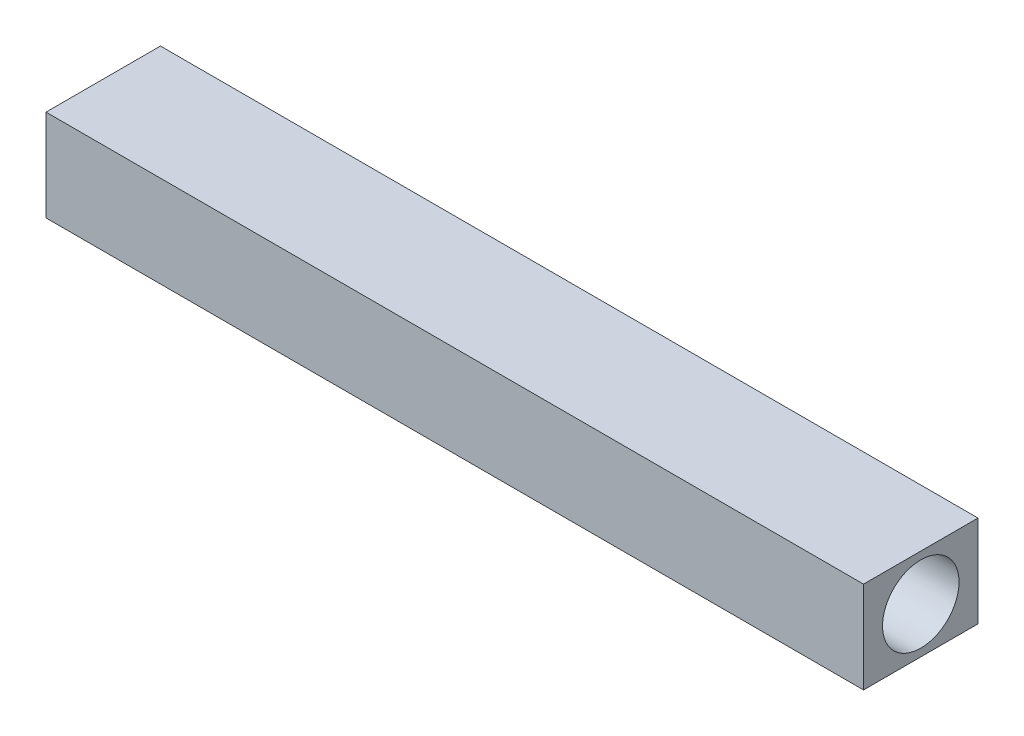
ISO-10303-21;
HEADER;
FILE_DESCRIPTION(('STEP AP214'),'2;1');
FILE_NAME('part.step','',(''),(''),'','','');
FILE_SCHEMA(('AUTOMOTIVE_DESIGN { 1 0 10303 214 1 1 1 1 }'));
ENDSEC;
DATA;
#1=APPLICATION_CONTEXT('core data for automotive mechanical design processes');
#2=APPLICATION_PROTOCOL_DEFINITION('international standard','automotive_design',2000,#1);
#3=PRODUCT_CONTEXT('',#1,'mechanical');
#4=PRODUCT('Part','Part','',(#3));
#5=PRODUCT_RELATED_PRODUCT_CATEGORY('part','',(#4));
#6=PRODUCT_DEFINITION_FORMATION('','',#4);
#7=PRODUCT_DEFINITION_CONTEXT('part definition',#1,'design');
#8=PRODUCT_DEFINITION('design','',#6,#7);
#9=PRODUCT_DEFINITION_SHAPE('','',#8);
#10=(LENGTH_UNIT() NAMED_UNIT(*) SI_UNIT(.MILLI.,.METRE.));
#11=(NAMED_UNIT(*) PLANE_ANGLE_UNIT() SI_UNIT($,.RADIAN.));
#12=(NAMED_UNIT(*) SI_UNIT($,.STERADIAN.) SOLID_ANGLE_UNIT());
#13=UNCERTAINTY_MEASURE_WITH_UNIT(LENGTH_MEASURE(1.E-05),#10,'distance_accuracy_value','');
#14=(GEOMETRIC_REPRESENTATION_CONTEXT(3) GLOBAL_UNCERTAINTY_ASSIGNED_CONTEXT((#13)) GLOBAL_UNIT_ASSIGNED_CONTEXT((#10,
#11,#12)) REPRESENTATION_CONTEXT('',''));
#15=CARTESIAN_POINT('',(0.,0.,0.));
#16=DIRECTION('',(0.,0.,1.));
#17=DIRECTION('',(1.,0.,0.));
#18=AXIS2_PLACEMENT_3D('',#15,#16,#17);
#19=CARTESIAN_POINT('',(-31.75,10.16,44.45));
#20=DIRECTION('',(1.,0.,0.));
#21=DIRECTION('',(0.,0.,-1.));
#22=AXIS2_PLACEMENT_3D('',#19,#20,#21);
#23=PLANE('',#22);
#24=CARTESIAN_POINT('',(-31.75,6.6,48.895));
#25=DIRECTION('',(1.,0.,0.));
#26=DIRECTION('',(0.,0.,-1.));
#27=AXIS2_PLACEMENT_3D('',#24,#25,#26);
#28=CIRCLE('',#27,2.9718);
#29=CARTESIAN_POINT('',(-31.75,6.6,51.8668));
#30=VERTEX_POINT('',#29);
#31=EDGE_CURVE('E224',#30,#30,#28,.T.);
#32=ORIENTED_EDGE('',*,*,#31,.T.);
#33=EDGE_LOOP('',(#32));
#34=FACE_BOUND('',#33,.T.);
#35=DIRECTION('',(0.,1.,0.));
#36=VECTOR('',#35,1.);
#37=CARTESIAN_POINT('',(-31.75,-64.1192802517308,44.45));
#38=LINE('',#37,#36);
#39=CARTESIAN_POINT('',(-31.75,3.04,44.45));
#40=VERTEX_POINT('',#39);
#41=CARTESIAN_POINT('',(-31.75,10.16,44.45));
#42=VERTEX_POINT('',#41);
#43=EDGE_CURVE('E89',#40,#42,#38,.T.);
#44=ORIENTED_EDGE('',*,*,#43,.F.);
#45=DIRECTION('',(0.,0.,-1.));
#46=VECTOR('',#45,1.);
#47=CARTESIAN_POINT('',(-31.75,3.04,116.841968473426));
#48=LINE('',#47,#46);
#49=CARTESIAN_POINT('',(-31.75,3.04,53.34));
#50=VERTEX_POINT('',#49);
#51=EDGE_CURVE('E45',#50,#40,#48,.T.);
#52=ORIENTED_EDGE('',*,*,#51,.F.);
#53=DIRECTION('',(0.,1.,0.));
#54=VECTOR('',#53,1.);
#55=CARTESIAN_POINT('',(-31.75,-64.1192802517308,53.34));
#56=LINE('',#55,#54);
#57=CARTESIAN_POINT('',(-31.75,10.16,53.34));
#58=VERTEX_POINT('',#57);
#59=EDGE_CURVE('E97',#50,#58,#56,.T.);
#60=ORIENTED_EDGE('',*,*,#59,.T.);
#61=DIRECTION('',(0.,0.,1.));
#62=VECTOR('',#61,1.);
#63=CARTESIAN_POINT('',(-31.75,10.16,44.45));
#64=LINE('',#63,#62);
#65=EDGE_CURVE('E81',#42,#58,#64,.T.);
#66=ORIENTED_EDGE('',*,*,#65,.F.);
#67=EDGE_LOOP('',(#44,#52,#60,#66));
#68=FACE_BOUND('',#67,.T.);
#69=ADVANCED_FACE('F35',(#34,#68),#23,.F.);
#70=CARTESIAN_POINT('',(31.75,2.54,49.53));
#71=DIRECTION('',(-1.,0.,0.));
#72=DIRECTION('',(0.,0.,1.));
#73=AXIS2_PLACEMENT_3D('',#70,#71,#72);
#74=PLANE('',#73);
#75=CARTESIAN_POINT('',(31.75,6.6,48.895));
#76=DIRECTION('',(1.,0.,0.));
#77=DIRECTION('',(0.,0.,-1.));
#78=AXIS2_PLACEMENT_3D('',#75,#76,#77);
#79=CIRCLE('',#78,2.9718);
#80=CARTESIAN_POINT('',(31.75,6.6,45.9232));
#81=VERTEX_POINT('',#80);
#82=EDGE_CURVE('E100',#81,#81,#79,.T.);
#83=ORIENTED_EDGE('',*,*,#82,.F.);
#84=EDGE_LOOP('',(#83));
#85=FACE_BOUND('',#84,.T.);
#86=DIRECTION('',(0.,0.,-1.));
#87=VECTOR('',#86,1.);
#88=CARTESIAN_POINT('',(31.75,10.16,44.45));
#89=LINE('',#88,#87);
#90=CARTESIAN_POINT('',(31.75,10.16,53.34));
#91=VERTEX_POINT('',#90);
#92=CARTESIAN_POINT('',(31.75,10.16,44.45));
#93=VERTEX_POINT('',#92);
#94=EDGE_CURVE('E103',#91,#93,#89,.T.);
#95=ORIENTED_EDGE('',*,*,#94,.F.);
#96=DIRECTION('',(0.,1.,0.));
#97=VECTOR('',#96,1.);
#98=CARTESIAN_POINT('',(31.75,-64.1192802517308,53.34));
#99=LINE('',#98,#97);
#100=CARTESIAN_POINT('',(31.75,3.04,53.34));
#101=VERTEX_POINT('',#100);
#102=EDGE_CURVE('E39',#101,#91,#99,.T.);
#103=ORIENTED_EDGE('',*,*,#102,.F.);
#104=DIRECTION('',(0.,0.,-1.));
#105=VECTOR('',#104,1.);
#106=CARTESIAN_POINT('',(31.75,3.04,116.841968473426));
#107=LINE('',#106,#105);
#108=CARTESIAN_POINT('',(31.75,3.04,44.45));
#109=VERTEX_POINT('',#108);
#110=EDGE_CURVE('E73',#101,#109,#107,.T.);
#111=ORIENTED_EDGE('',*,*,#110,.T.);
#112=DIRECTION('',(0.,1.,0.));
#113=VECTOR('',#112,1.);
#114=CARTESIAN_POINT('',(31.75,-64.1192802517308,44.45));
#115=LINE('',#114,#113);
#116=EDGE_CURVE('E75',#109,#93,#115,.T.);
#117=ORIENTED_EDGE('',*,*,#116,.T.);
#118=EDGE_LOOP('',(#95,#103,#111,#117));
#119=FACE_BOUND('',#118,.T.);
#120=ADVANCED_FACE('F37',(#85,#119),#74,.F.);
#121=CARTESIAN_POINT('',(-31.75,-64.1192802517308,53.34));
#122=DIRECTION('',(0.,0.,1.));
#123=DIRECTION('',(1.,0.,0.));
#124=AXIS2_PLACEMENT_3D('',#121,#122,#123);
#125=PLANE('',#124);
#126=DIRECTION('',(1.,0.,0.));
#127=VECTOR('',#126,1.);
#128=CARTESIAN_POINT('',(31.75,3.04,53.34));
#129=LINE('',#128,#127);
#130=EDGE_CURVE('E80',#50,#101,#129,.T.);
#131=ORIENTED_EDGE('',*,*,#130,.T.);
#132=ORIENTED_EDGE('',*,*,#102,.T.);
#133=DIRECTION('',(1.,0.,0.));
#134=VECTOR('',#133,1.);
#135=CARTESIAN_POINT('',(-31.75,10.16,53.34));
#136=LINE('',#135,#134);
#137=EDGE_CURVE('E104',#58,#91,#136,.T.);
#138=ORIENTED_EDGE('',*,*,#137,.F.);
#139=ORIENTED_EDGE('',*,*,#59,.F.);
#140=EDGE_LOOP('',(#131,#132,#138,#139));
#141=FACE_BOUND('',#140,.T.);
#142=ADVANCED_FACE('F113',(#141),#125,.T.);
#143=CARTESIAN_POINT('',(-31.75,-64.1192802517308,44.45));
#144=DIRECTION('',(0.,0.,-1.));
#145=DIRECTION('',(-1.,0.,0.));
#146=AXIS2_PLACEMENT_3D('',#143,#144,#145);
#147=PLANE('',#146);
#148=DIRECTION('',(1.,0.,0.));
#149=VECTOR('',#148,1.);
#150=CARTESIAN_POINT('',(31.75,3.04,44.45));
#151=LINE('',#150,#149);
#152=EDGE_CURVE('E11',#40,#109,#151,.T.);
#153=ORIENTED_EDGE('',*,*,#152,.F.);
#154=ORIENTED_EDGE('',*,*,#43,.T.);
#155=DIRECTION('',(-1.,0.,0.));
#156=VECTOR('',#155,1.);
#157=CARTESIAN_POINT('',(-31.75,10.16,44.45));
#158=LINE('',#157,#156);
#159=EDGE_CURVE('E88',#93,#42,#158,.T.);
#160=ORIENTED_EDGE('',*,*,#159,.F.);
#161=ORIENTED_EDGE('',*,*,#116,.F.);
#162=EDGE_LOOP('',(#153,#154,#160,#161));
#163=FACE_BOUND('',#162,.T.);
#164=ADVANCED_FACE('F85',(#163),#147,.T.);
#165=CARTESIAN_POINT('',(31.75,3.04,116.841968473426));
#166=DIRECTION('',(0.,1.,0.));
#167=DIRECTION('',(0.,0.,1.));
#168=AXIS2_PLACEMENT_3D('',#165,#166,#167);
#169=PLANE('',#168);
#170=ORIENTED_EDGE('',*,*,#130,.F.);
#171=ORIENTED_EDGE('',*,*,#51,.T.);
#172=ORIENTED_EDGE('',*,*,#152,.T.);
#173=ORIENTED_EDGE('',*,*,#110,.F.);
#174=EDGE_LOOP('',(#170,#171,#172,#173));
#175=FACE_BOUND('',#174,.T.);
#176=ADVANCED_FACE('F92',(#175),#169,.F.);
#177=CARTESIAN_POINT('',(0.,10.16,0.));
#178=DIRECTION('',(0.,1.,0.));
#179=DIRECTION('',(0.,0.,1.));
#180=AXIS2_PLACEMENT_3D('',#177,#178,#179);
#181=PLANE('',#180);
#182=ORIENTED_EDGE('',*,*,#159,.T.);
#183=ORIENTED_EDGE('',*,*,#65,.T.);
#184=ORIENTED_EDGE('',*,*,#137,.T.);
#185=ORIENTED_EDGE('',*,*,#94,.T.);
#186=EDGE_LOOP('',(#182,#183,#184,#185));
#187=FACE_BOUND('',#186,.T.);
#188=ADVANCED_FACE('F112',(#187),#181,.T.);
#189=CARTESIAN_POINT('',(26.35,6.6,48.895));
#190=DIRECTION('',(1.,0.,0.));
#191=DIRECTION('',(0.,0.,-1.));
#192=AXIS2_PLACEMENT_3D('',#189,#190,#191);
#193=CYLINDRICAL_SURFACE('',#192,2.9718);
#194=CARTESIAN_POINT('',(26.35,6.6,48.895));
#195=DIRECTION('',(1.,0.,0.));
#196=DIRECTION('',(0.,0.,-1.));
#197=AXIS2_PLACEMENT_3D('',#194,#195,#196);
#198=CIRCLE('',#197,2.9718);
#199=CARTESIAN_POINT('',(26.35,6.6,45.9232));
#200=VERTEX_POINT('',#199);
#201=EDGE_CURVE('E90',#200,#200,#198,.T.);
#202=CARTESIAN_POINT('',(26.35,6.6,45.9232));
#203=CARTESIAN_POINT('',(26.40625,6.6,45.9232));
#204=CARTESIAN_POINT('',(26.4625,6.6,45.9232));
#205=CARTESIAN_POINT('',(26.575,6.6,45.9232));
#206=CARTESIAN_POINT('',(26.63125,6.6,45.9232));
#207=CARTESIAN_POINT('',(26.74375,6.6,45.9232));
#208=CARTESIAN_POINT('',(26.8,6.6,45.9232));
#209=CARTESIAN_POINT('',(26.9125,6.6,45.9232));
#210=CARTESIAN_POINT('',(26.96875,6.6,45.9232));
#211=CARTESIAN_POINT('',(27.08125,6.6,45.9232));
#212=CARTESIAN_POINT('',(27.1375,6.6,45.9232));
#213=CARTESIAN_POINT('',(27.25,6.6,45.9232));
#214=CARTESIAN_POINT('',(27.30625,6.6,45.9232));
#215=CARTESIAN_POINT('',(27.41875,6.6,45.9232));
#216=CARTESIAN_POINT('',(27.475,6.6,45.9232));
#217=CARTESIAN_POINT('',(27.5875,6.6,45.9232));
#218=CARTESIAN_POINT('',(27.64375,6.6,45.9232));
#219=CARTESIAN_POINT('',(27.75625,6.6,45.9232));
#220=CARTESIAN_POINT('',(27.8125,6.6,45.9232));
#221=CARTESIAN_POINT('',(27.925,6.6,45.9232));
#222=CARTESIAN_POINT('',(27.98125,6.6,45.9232));
#223=CARTESIAN_POINT('',(28.09375,6.6,45.9232));
#224=CARTESIAN_POINT('',(28.15,6.6,45.9232));
#225=CARTESIAN_POINT('',(28.2625,6.6,45.9232));
#226=CARTESIAN_POINT('',(28.31875,6.6,45.9232));
#227=CARTESIAN_POINT('',(28.43125,6.6,45.9232));
#228=CARTESIAN_POINT('',(28.4875,6.6,45.9232));
#229=CARTESIAN_POINT('',(28.6,6.6,45.9232));
#230=CARTESIAN_POINT('',(28.65625,6.6,45.9232));
#231=CARTESIAN_POINT('',(28.76875,6.6,45.9232));
#232=CARTESIAN_POINT('',(28.825,6.6,45.9232));
#233=CARTESIAN_POINT('',(28.9375,6.6,45.9232));
#234=CARTESIAN_POINT('',(28.99375,6.6,45.9232));
#235=CARTESIAN_POINT('',(29.10625,6.6,45.9232));
#236=CARTESIAN_POINT('',(29.1625,6.6,45.9232));
#237=CARTESIAN_POINT('',(29.275,6.6,45.9232));
#238=CARTESIAN_POINT('',(29.33125,6.6,45.9232));
#239=CARTESIAN_POINT('',(29.44375,6.6,45.9232));
#240=CARTESIAN_POINT('',(29.5,6.6,45.9232));
#241=CARTESIAN_POINT('',(29.6125,6.6,45.9232));
#242=CARTESIAN_POINT('',(29.66875,6.6,45.9232));
#243=CARTESIAN_POINT('',(29.78125,6.6,45.9232));
#244=CARTESIAN_POINT('',(29.8375,6.6,45.9232));
#245=CARTESIAN_POINT('',(29.95,6.6,45.9232));
#246=CARTESIAN_POINT('',(30.00625,6.6,45.9232));
#247=CARTESIAN_POINT('',(30.11875,6.6,45.9232));
#248=CARTESIAN_POINT('',(30.175,6.6,45.9232));
#249=CARTESIAN_POINT('',(30.2875,6.6,45.9232));
#250=CARTESIAN_POINT('',(30.34375,6.6,45.9232));
#251=CARTESIAN_POINT('',(30.45625,6.6,45.9232));
#252=CARTESIAN_POINT('',(30.5125,6.6,45.9232));
#253=CARTESIAN_POINT('',(30.625,6.6,45.9232));
#254=CARTESIAN_POINT('',(30.68125,6.6,45.9232));
#255=CARTESIAN_POINT('',(30.79375,6.6,45.9232));
#256=CARTESIAN_POINT('',(30.85,6.6,45.9232));
#257=CARTESIAN_POINT('',(30.9625,6.6,45.9232));
#258=CARTESIAN_POINT('',(31.01875,6.6,45.9232));
#259=CARTESIAN_POINT('',(31.13125,6.6,45.9232));
#260=CARTESIAN_POINT('',(31.1875,6.6,45.9232));
#261=CARTESIAN_POINT('',(31.3,6.6,45.9232));
#262=CARTESIAN_POINT('',(31.35625,6.6,45.9232));
#263=CARTESIAN_POINT('',(31.46875,6.6,45.9232));
#264=CARTESIAN_POINT('',(31.525,6.6,45.9232));
#265=CARTESIAN_POINT('',(31.6375,6.6,45.9232));
#266=CARTESIAN_POINT('',(31.69375,6.6,45.9232));
#267=CARTESIAN_POINT('',(31.75,6.6,45.9232));
#268=B_SPLINE_CURVE_WITH_KNOTS('',3,(#202,#203,#204,#205,#206,#207,#208,#209,#210,#211,#212,
#213,#214,#215,#216,#217,#218,#219,#220,#221,#222,#223,#224,#225,#226,#227,#228,#229,#230,#231,
#232,#233,#234,#235,#236,#237,#238,#239,#240,#241,#242,#243,#244,#245,#246,#247,#248,#249,#250,
#251,#252,#253,#254,#255,#256,#257,#258,#259,#260,#261,#262,#263,#264,#265,#266,#267),
.UNSPECIFIED.,.F.,.F.,(4,2,2,2,2,2,2,2,2,2,2,2,2,2,2,2,2,2,2,2,2,2,2,2,2,2,2,2,2,2,2,2,4),(0.,
0.168750000000002,0.337500000000001,0.506250000000003,0.675000000000002,0.843750000000001,
1.0125,1.18125,1.35,1.51875,1.6875,1.85625,2.025,2.19375,2.3625,2.53125,2.7,2.86875,3.0375,
3.20625,3.375,3.54375,3.7125,3.88125,4.05,4.21875,4.3875,4.55625,4.725,4.89375,5.0625,5.23125,
5.40000000000001),.UNSPECIFIED.);
#269=EDGE_CURVE('BSEAM116',#200,#81,#268,.T.);
#270=ORIENTED_EDGE('',*,*,#201,.F.);
#271=ORIENTED_EDGE('',*,*,#82,.T.);
#272=ORIENTED_EDGE('',*,*,#269,.T.);
#273=ORIENTED_EDGE('',*,*,#269,.F.);
#274=EDGE_LOOP('',(#270,#272,#271,#273));
#275=FACE_BOUND('',#274,.T.);
#276=ADVANCED_FACE('F116',(#275),#193,.F.);
#277=CARTESIAN_POINT('',(26.35,6.6,48.895));
#278=DIRECTION('',(1.,0.,0.));
#279=DIRECTION('',(0.,0.,-1.));
#280=AXIS2_PLACEMENT_3D('',#277,#278,#279);
#281=PLANE('',#280);
#282=ORIENTED_EDGE('',*,*,#201,.T.);
#283=EDGE_LOOP('',(#282));
#284=FACE_BOUND('',#283,.T.);
#285=ADVANCED_FACE('F125',(#284),#281,.T.);
#286=CARTESIAN_POINT('',(-26.35,6.6,48.895));
#287=DIRECTION('',(-1.,0.,0.));
#288=DIRECTION('',(0.,0.,1.));
#289=AXIS2_PLACEMENT_3D('',#286,#287,#288);
#290=CYLINDRICAL_SURFACE('',#289,2.9718);
#291=CARTESIAN_POINT('',(-26.35,6.6,48.895));
#292=DIRECTION('',(1.,0.,0.));
#293=DIRECTION('',(0.,0.,-1.));
#294=AXIS2_PLACEMENT_3D('',#291,#292,#293);
#295=CIRCLE('',#294,2.9718);
#296=CARTESIAN_POINT('',(-26.35,6.6,51.8668));
#297=VERTEX_POINT('',#296);
#298=EDGE_CURVE('E223',#297,#297,#295,.T.);
#299=CARTESIAN_POINT('',(-26.35,6.6,51.8668));
#300=CARTESIAN_POINT('',(-26.40625,6.6,51.8668));
#301=CARTESIAN_POINT('',(-26.4625,6.6,51.8668));
#302=CARTESIAN_POINT('',(-26.575,6.6,51.8668));
#303=CARTESIAN_POINT('',(-26.63125,6.6,51.8668));
#304=CARTESIAN_POINT('',(-26.74375,6.6,51.8668));
#305=CARTESIAN_POINT('',(-26.8,6.6,51.8668));
#306=CARTESIAN_POINT('',(-26.9125,6.6,51.8668));
#307=CARTESIAN_POINT('',(-26.96875,6.6,51.8668));
#308=CARTESIAN_POINT('',(-27.08125,6.6,51.8668));
#309=CARTESIAN_POINT('',(-27.1375,6.6,51.8668));
#310=CARTESIAN_POINT('',(-27.25,6.6,51.8668));
#311=CARTESIAN_POINT('',(-27.30625,6.6,51.8668));
#312=CARTESIAN_POINT('',(-27.41875,6.6,51.8668));
#313=CARTESIAN_POINT('',(-27.475,6.6,51.8668));
#314=CARTESIAN_POINT('',(-27.5875,6.6,51.8668));
#315=CARTESIAN_POINT('',(-27.64375,6.6,51.8668));
#316=CARTESIAN_POINT('',(-27.75625,6.6,51.8668));
#317=CARTESIAN_POINT('',(-27.8125,6.6,51.8668));
#318=CARTESIAN_POINT('',(-27.925,6.6,51.8668));
#319=CARTESIAN_POINT('',(-27.98125,6.6,51.8668));
#320=CARTESIAN_POINT('',(-28.09375,6.6,51.8668));
#321=CARTESIAN_POINT('',(-28.15,6.6,51.8668));
#322=CARTESIAN_POINT('',(-28.2625,6.6,51.8668));
#323=CARTESIAN_POINT('',(-28.31875,6.6,51.8668));
#324=CARTESIAN_POINT('',(-28.43125,6.6,51.8668));
#325=CARTESIAN_POINT('',(-28.4875,6.6,51.8668));
#326=CARTESIAN_POINT('',(-28.6,6.6,51.8668));
#327=CARTESIAN_POINT('',(-28.65625,6.6,51.8668));
#328=CARTESIAN_POINT('',(-28.76875,6.6,51.8668));
#329=CARTESIAN_POINT('',(-28.825,6.6,51.8668));
#330=CARTESIAN_POINT('',(-28.9375,6.6,51.8668));
#331=CARTESIAN_POINT('',(-28.99375,6.6,51.8668));
#332=CARTESIAN_POINT('',(-29.10625,6.6,51.8668));
#333=CARTESIAN_POINT('',(-29.1625,6.6,51.8668));
#334=CARTESIAN_POINT('',(-29.275,6.6,51.8668));
#335=CARTESIAN_POINT('',(-29.33125,6.6,51.8668));
#336=CARTESIAN_POINT('',(-29.44375,6.6,51.8668));
#337=CARTESIAN_POINT('',(-29.5,6.6,51.8668));
#338=CARTESIAN_POINT('',(-29.6125,6.6,51.8668));
#339=CARTESIAN_POINT('',(-29.66875,6.6,51.8668));
#340=CARTESIAN_POINT('',(-29.78125,6.6,51.8668));
#341=CARTESIAN_POINT('',(-29.8375,6.6,51.8668));
#342=CARTESIAN_POINT('',(-29.95,6.6,51.8668));
#343=CARTESIAN_POINT('',(-30.00625,6.6,51.8668));
#344=CARTESIAN_POINT('',(-30.11875,6.6,51.8668));
#345=CARTESIAN_POINT('',(-30.175,6.6,51.8668));
#346=CARTESIAN_POINT('',(-30.2875,6.6,51.8668));
#347=CARTESIAN_POINT('',(-30.34375,6.6,51.8668));
#348=CARTESIAN_POINT('',(-30.45625,6.6,51.8668));
#349=CARTESIAN_POINT('',(-30.5125,6.6,51.8668));
#350=CARTESIAN_POINT('',(-30.625,6.6,51.8668));
#351=CARTESIAN_POINT('',(-30.68125,6.6,51.8668));
#352=CARTESIAN_POINT('',(-30.79375,6.6,51.8668));
#353=CARTESIAN_POINT('',(-30.85,6.6,51.8668));
#354=CARTESIAN_POINT('',(-30.9625,6.6,51.8668));
#355=CARTESIAN_POINT('',(-31.01875,6.6,51.8668));
#356=CARTESIAN_POINT('',(-31.13125,6.6,51.8668));
#357=CARTESIAN_POINT('',(-31.1875,6.6,51.8668));
#358=CARTESIAN_POINT('',(-31.3,6.6,51.8668));
#359=CARTESIAN_POINT('',(-31.35625,6.6,51.8668));
#360=CARTESIAN_POINT('',(-31.46875,6.6,51.8668));
#361=CARTESIAN_POINT('',(-31.525,6.6,51.8668));
#362=CARTESIAN_POINT('',(-31.6375,6.6,51.8668));
#363=CARTESIAN_POINT('',(-31.69375,6.6,51.8668));
#364=CARTESIAN_POINT('',(-31.75,6.6,51.8668));
#365=B_SPLINE_CURVE_WITH_KNOTS('',3,(#299,#300,#301,#302,#303,#304,#305,#306,#307,#308,#309,
#310,#311,#312,#313,#314,#315,#316,#317,#318,#319,#320,#321,#322,#323,#324,#325,#326,#327,#328,
#329,#330,#331,#332,#333,#334,#335,#336,#337,#338,#339,#340,#341,#342,#343,#344,#345,#346,#347,
#348,#349,#350,#351,#352,#353,#354,#355,#356,#357,#358,#359,#360,#361,#362,#363,#364),
.UNSPECIFIED.,.F.,.F.,(4,2,2,2,2,2,2,2,2,2,2,2,2,2,2,2,2,2,2,2,2,2,2,2,2,2,2,2,2,2,2,2,4),(0.,
0.168749999999999,0.337499999999998,0.50625,0.674999999999998,0.843749999999997,1.0125,1.18125,
1.35,1.51875,1.6875,1.85625,2.025,2.19375,2.3625,2.53125,2.7,2.86875,3.0375,3.20625,3.375,
3.54375,3.7125,3.88125,4.05,4.21875,4.3875,4.55625,4.725,4.89375,5.0625,5.23125,5.4),.UNSPECIFIED.);
#366=EDGE_CURVE('BSEAM152',#297,#30,#365,.T.);
#367=ORIENTED_EDGE('',*,*,#298,.T.);
#368=ORIENTED_EDGE('',*,*,#31,.F.);
#369=ORIENTED_EDGE('',*,*,#366,.T.);
#370=ORIENTED_EDGE('',*,*,#366,.F.);
#371=EDGE_LOOP('',(#367,#369,#368,#370));
#372=FACE_BOUND('',#371,.T.);
#373=ADVANCED_FACE('F152',(#372),#290,.F.);
#374=CARTESIAN_POINT('',(-26.35,6.6,48.895));
#375=DIRECTION('',(-1.,0.,0.));
#376=DIRECTION('',(0.,0.,-1.));
#377=AXIS2_PLACEMENT_3D('',#374,#375,#376);
#378=PLANE('',#377);
#379=ORIENTED_EDGE('',*,*,#298,.F.);
#380=EDGE_LOOP('',(#379));
#381=FACE_BOUND('',#380,.T.);
#382=ADVANCED_FACE('F161',(#381),#378,.T.);
#383=CLOSED_SHELL('',(#69,#120,#142,#164,#176,#188,#276,#285,#373,#382));
#384=MANIFOLD_SOLID_BREP('B2',#383);
#385=ADVANCED_BREP_SHAPE_REPRESENTATION('',(#18,#384),#14);
#386=SHAPE_DEFINITION_REPRESENTATION(#9,#385);
ENDSEC;
END-ISO-10303-21;
